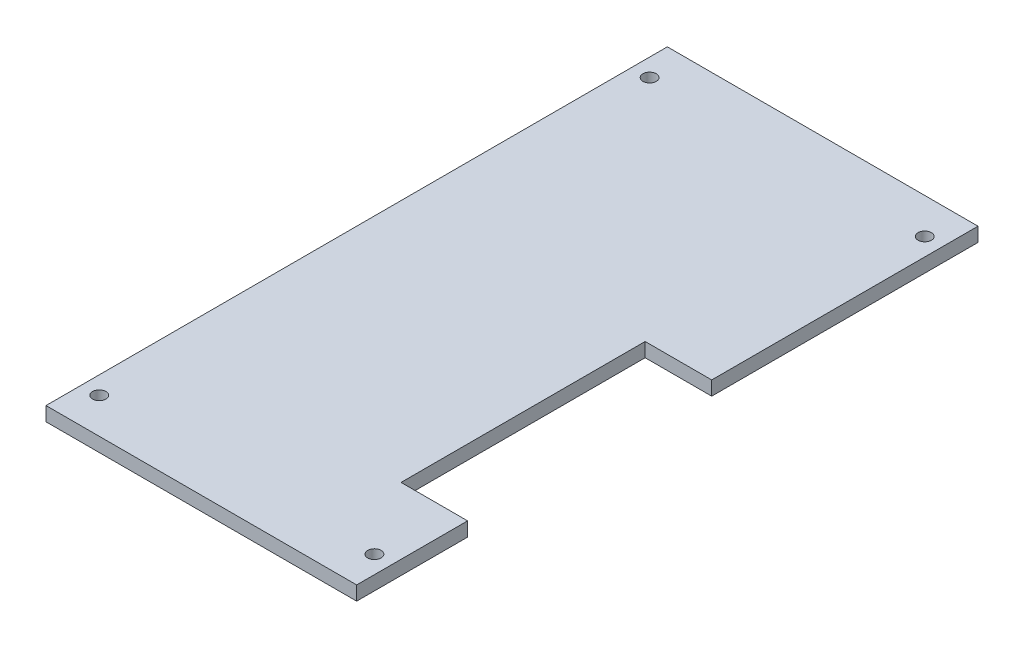
ISO-10303-21;
HEADER;
FILE_DESCRIPTION(('STEP AP214'),'2;1');
FILE_NAME('part.step','',(''),(''),'','','');
FILE_SCHEMA(('AUTOMOTIVE_DESIGN { 1 0 10303 214 1 1 1 1 }'));
ENDSEC;
DATA;
#1=APPLICATION_CONTEXT('core data for automotive mechanical design processes');
#2=APPLICATION_PROTOCOL_DEFINITION('international standard','automotive_design',2000,#1);
#3=PRODUCT_CONTEXT('',#1,'mechanical');
#4=PRODUCT('Part','Part','',(#3));
#5=PRODUCT_RELATED_PRODUCT_CATEGORY('part','',(#4));
#6=PRODUCT_DEFINITION_FORMATION('','',#4);
#7=PRODUCT_DEFINITION_CONTEXT('part definition',#1,'design');
#8=PRODUCT_DEFINITION('design','',#6,#7);
#9=PRODUCT_DEFINITION_SHAPE('','',#8);
#10=(LENGTH_UNIT() NAMED_UNIT(*) SI_UNIT(.MILLI.,.METRE.));
#11=(NAMED_UNIT(*) PLANE_ANGLE_UNIT() SI_UNIT($,.RADIAN.));
#12=(NAMED_UNIT(*) SI_UNIT($,.STERADIAN.) SOLID_ANGLE_UNIT());
#13=UNCERTAINTY_MEASURE_WITH_UNIT(LENGTH_MEASURE(1.E-05),#10,'distance_accuracy_value','');
#14=(GEOMETRIC_REPRESENTATION_CONTEXT(3) GLOBAL_UNCERTAINTY_ASSIGNED_CONTEXT((#13)) GLOBAL_UNIT_ASSIGNED_CONTEXT((#10,
#11,#12)) REPRESENTATION_CONTEXT('',''));
#15=CARTESIAN_POINT('',(0.,0.,0.));
#16=DIRECTION('',(0.,0.,1.));
#17=DIRECTION('',(1.,0.,0.));
#18=AXIS2_PLACEMENT_3D('',#15,#16,#17);
#19=CARTESIAN_POINT('',(0.,3.175,0.));
#20=DIRECTION('',(0.,1.,0.));
#21=DIRECTION('',(0.,0.,1.));
#22=AXIS2_PLACEMENT_3D('',#19,#20,#21);
#23=PLANE('',#22);
#24=CARTESIAN_POINT('',(-31.,3.175,-62.));
#25=DIRECTION('',(0.,1.,0.));
#26=DIRECTION('',(0.,0.,1.));
#27=AXIS2_PLACEMENT_3D('',#24,#25,#26);
#28=CIRCLE('',#27,1.5);
#29=CARTESIAN_POINT('',(-31.,3.175,-60.5));
#30=VERTEX_POINT('',#29);
#31=EDGE_CURVE('E192',#30,#30,#28,.T.);
#32=ORIENTED_EDGE('',*,*,#31,.F.);
#33=EDGE_LOOP('',(#32));
#34=FACE_BOUND('',#33,.T.);
#35=CARTESIAN_POINT('',(31.,3.175,62.));
#36=DIRECTION('',(0.,1.,0.));
#37=DIRECTION('',(0.,0.,1.));
#38=AXIS2_PLACEMENT_3D('',#35,#36,#37);
#39=CIRCLE('',#38,1.50000000000001);
#40=CARTESIAN_POINT('',(31.,3.175,63.5));
#41=VERTEX_POINT('',#40);
#42=EDGE_CURVE('E138',#41,#41,#39,.T.);
#43=ORIENTED_EDGE('',*,*,#42,.F.);
#44=EDGE_LOOP('',(#43));
#45=FACE_BOUND('',#44,.T.);
#46=DIRECTION('',(0.,0.,1.));
#47=VECTOR('',#46,1.);
#48=CARTESIAN_POINT('',(-35.,3.175,70.));
#49=LINE('',#48,#47);
#50=CARTESIAN_POINT('',(-35.,3.175,-70.));
#51=VERTEX_POINT('',#50);
#52=CARTESIAN_POINT('',(-35.,3.175,70.));
#53=VERTEX_POINT('',#52);
#54=EDGE_CURVE('E149',#51,#53,#49,.T.);
#55=ORIENTED_EDGE('',*,*,#54,.T.);
#56=DIRECTION('',(1.,0.,0.));
#57=VECTOR('',#56,1.);
#58=CARTESIAN_POINT('',(35.,3.175,70.));
#59=LINE('',#58,#57);
#60=CARTESIAN_POINT('',(35.,3.175,70.));
#61=VERTEX_POINT('',#60);
#62=EDGE_CURVE('E97',#53,#61,#59,.T.);
#63=ORIENTED_EDGE('',*,*,#62,.T.);
#64=DIRECTION('',(0.,0.,-1.));
#65=VECTOR('',#64,1.);
#66=CARTESIAN_POINT('',(35.,3.175,70.));
#67=LINE('',#66,#65);
#68=CARTESIAN_POINT('',(35.,3.175,45.));
#69=VERTEX_POINT('',#68);
#70=EDGE_CURVE('E164',#61,#69,#67,.T.);
#71=ORIENTED_EDGE('',*,*,#70,.T.);
#72=DIRECTION('',(-1.,0.,0.));
#73=VECTOR('',#72,1.);
#74=CARTESIAN_POINT('',(20.,3.175,45.));
#75=LINE('',#74,#73);
#76=CARTESIAN_POINT('',(20.,3.175,45.));
#77=VERTEX_POINT('',#76);
#78=EDGE_CURVE('E177',#69,#77,#75,.T.);
#79=ORIENTED_EDGE('',*,*,#78,.T.);
#80=DIRECTION('',(0.,0.,-1.));
#81=VECTOR('',#80,1.);
#82=CARTESIAN_POINT('',(20.,3.175,-9.99999998199999));
#83=LINE('',#82,#81);
#84=CARTESIAN_POINT('',(20.,3.175,-9.99999998199999));
#85=VERTEX_POINT('',#84);
#86=EDGE_CURVE('E116',#77,#85,#83,.T.);
#87=ORIENTED_EDGE('',*,*,#86,.T.);
#88=DIRECTION('',(1.,0.,0.));
#89=VECTOR('',#88,1.);
#90=CARTESIAN_POINT('',(35.,3.175,-9.99999998199999));
#91=LINE('',#90,#89);
#92=CARTESIAN_POINT('',(35.,3.175,-9.99999998199999));
#93=VERTEX_POINT('',#92);
#94=EDGE_CURVE('E110',#85,#93,#91,.T.);
#95=ORIENTED_EDGE('',*,*,#94,.T.);
#96=DIRECTION('',(0.,0.,-1.));
#97=VECTOR('',#96,1.);
#98=CARTESIAN_POINT('',(35.,3.175,-9.99999998199999));
#99=LINE('',#98,#97);
#100=CARTESIAN_POINT('',(35.,3.175,-70.));
#101=VERTEX_POINT('',#100);
#102=EDGE_CURVE('E114',#93,#101,#99,.T.);
#103=ORIENTED_EDGE('',*,*,#102,.T.);
#104=DIRECTION('',(-1.,0.,0.));
#105=VECTOR('',#104,1.);
#106=CARTESIAN_POINT('',(35.,3.175,-70.));
#107=LINE('',#106,#105);
#108=EDGE_CURVE('E54',#101,#51,#107,.T.);
#109=ORIENTED_EDGE('',*,*,#108,.T.);
#110=EDGE_LOOP('',(#55,#63,#71,#79,#87,#95,#103,#109));
#111=FACE_BOUND('',#110,.T.);
#112=CARTESIAN_POINT('',(-31.,3.175,62.));
#113=DIRECTION('',(0.,1.,0.));
#114=DIRECTION('',(0.,0.,-1.));
#115=AXIS2_PLACEMENT_3D('',#112,#113,#114);
#116=CIRCLE('',#115,1.50000000000001);
#117=CARTESIAN_POINT('',(-31.,3.175,60.5));
#118=VERTEX_POINT('',#117);
#119=EDGE_CURVE('E186',#118,#118,#116,.T.);
#120=ORIENTED_EDGE('',*,*,#119,.F.);
#121=EDGE_LOOP('',(#120));
#122=FACE_BOUND('',#121,.T.);
#123=CARTESIAN_POINT('',(31.,3.175,-62.));
#124=DIRECTION('',(0.,1.,0.));
#125=DIRECTION('',(0.,0.,-1.));
#126=AXIS2_PLACEMENT_3D('',#123,#124,#125);
#127=CIRCLE('',#126,1.50000000000001);
#128=CARTESIAN_POINT('',(31.,3.175,-63.5));
#129=VERTEX_POINT('',#128);
#130=EDGE_CURVE('E198',#129,#129,#127,.T.);
#131=ORIENTED_EDGE('',*,*,#130,.F.);
#132=EDGE_LOOP('',(#131));
#133=FACE_BOUND('',#132,.T.);
#134=ADVANCED_FACE('F37',(#34,#45,#111,#122,#133),#23,.T.);
#135=CARTESIAN_POINT('',(0.,0.,0.));
#136=DIRECTION('',(0.,1.,0.));
#137=DIRECTION('',(0.,0.,1.));
#138=AXIS2_PLACEMENT_3D('',#135,#136,#137);
#139=PLANE('',#138);
#140=CARTESIAN_POINT('',(-31.,0.,-62.));
#141=DIRECTION('',(0.,1.,0.));
#142=DIRECTION('',(0.,0.,1.));
#143=AXIS2_PLACEMENT_3D('',#140,#141,#142);
#144=CIRCLE('',#143,1.5);
#145=CARTESIAN_POINT('',(-31.,0.,-60.5));
#146=VERTEX_POINT('',#145);
#147=EDGE_CURVE('E195',#146,#146,#144,.T.);
#148=ORIENTED_EDGE('',*,*,#147,.T.);
#149=EDGE_LOOP('',(#148));
#150=FACE_BOUND('',#149,.T.);
#151=CARTESIAN_POINT('',(31.,0.,62.));
#152=DIRECTION('',(0.,1.,0.));
#153=DIRECTION('',(0.,0.,1.));
#154=AXIS2_PLACEMENT_3D('',#151,#152,#153);
#155=CIRCLE('',#154,1.50000000000001);
#156=CARTESIAN_POINT('',(31.,0.,63.5));
#157=VERTEX_POINT('',#156);
#158=EDGE_CURVE('E183',#157,#157,#155,.T.);
#159=ORIENTED_EDGE('',*,*,#158,.T.);
#160=EDGE_LOOP('',(#159));
#161=FACE_BOUND('',#160,.T.);
#162=DIRECTION('',(0.,0.,1.));
#163=VECTOR('',#162,1.);
#164=CARTESIAN_POINT('',(-35.,0.,70.));
#165=LINE('',#164,#163);
#166=CARTESIAN_POINT('',(-35.,0.,-70.));
#167=VERTEX_POINT('',#166);
#168=CARTESIAN_POINT('',(-35.,0.,70.));
#169=VERTEX_POINT('',#168);
#170=EDGE_CURVE('E134',#167,#169,#165,.T.);
#171=ORIENTED_EDGE('',*,*,#170,.F.);
#172=DIRECTION('',(-1.,0.,0.));
#173=VECTOR('',#172,1.);
#174=CARTESIAN_POINT('',(35.,0.,-70.));
#175=LINE('',#174,#173);
#176=CARTESIAN_POINT('',(35.,0.,-70.));
#177=VERTEX_POINT('',#176);
#178=EDGE_CURVE('E89',#177,#167,#175,.T.);
#179=ORIENTED_EDGE('',*,*,#178,.F.);
#180=DIRECTION('',(0.,0.,-1.));
#181=VECTOR('',#180,1.);
#182=CARTESIAN_POINT('',(35.,0.,-9.99999998199999));
#183=LINE('',#182,#181);
#184=CARTESIAN_POINT('',(35.,0.,-9.99999998199999));
#185=VERTEX_POINT('',#184);
#186=EDGE_CURVE('E83',#185,#177,#183,.T.);
#187=ORIENTED_EDGE('',*,*,#186,.F.);
#188=DIRECTION('',(1.,0.,0.));
#189=VECTOR('',#188,1.);
#190=CARTESIAN_POINT('',(35.,0.,-9.99999998199999));
#191=LINE('',#190,#189);
#192=CARTESIAN_POINT('',(20.,0.,-9.99999998199999));
#193=VERTEX_POINT('',#192);
#194=EDGE_CURVE('E124',#193,#185,#191,.T.);
#195=ORIENTED_EDGE('',*,*,#194,.F.);
#196=DIRECTION('',(0.,0.,-1.));
#197=VECTOR('',#196,1.);
#198=CARTESIAN_POINT('',(20.,0.,-9.99999998199999));
#199=LINE('',#198,#197);
#200=CARTESIAN_POINT('',(20.,0.,45.));
#201=VERTEX_POINT('',#200);
#202=EDGE_CURVE('E144',#201,#193,#199,.T.);
#203=ORIENTED_EDGE('',*,*,#202,.F.);
#204=DIRECTION('',(-1.,0.,0.));
#205=VECTOR('',#204,1.);
#206=CARTESIAN_POINT('',(20.,0.,45.));
#207=LINE('',#206,#205);
#208=CARTESIAN_POINT('',(35.,0.,45.));
#209=VERTEX_POINT('',#208);
#210=EDGE_CURVE('E142',#209,#201,#207,.T.);
#211=ORIENTED_EDGE('',*,*,#210,.F.);
#212=DIRECTION('',(0.,0.,-1.));
#213=VECTOR('',#212,1.);
#214=CARTESIAN_POINT('',(35.,0.,70.));
#215=LINE('',#214,#213);
#216=CARTESIAN_POINT('',(35.,0.,70.));
#217=VERTEX_POINT('',#216);
#218=EDGE_CURVE('E140',#217,#209,#215,.T.);
#219=ORIENTED_EDGE('',*,*,#218,.F.);
#220=DIRECTION('',(1.,0.,0.));
#221=VECTOR('',#220,1.);
#222=CARTESIAN_POINT('',(35.,0.,70.));
#223=LINE('',#222,#221);
#224=EDGE_CURVE('E137',#169,#217,#223,.T.);
#225=ORIENTED_EDGE('',*,*,#224,.F.);
#226=EDGE_LOOP('',(#171,#179,#187,#195,#203,#211,#219,#225));
#227=FACE_BOUND('',#226,.T.);
#228=CARTESIAN_POINT('',(-31.,0.,62.));
#229=DIRECTION('',(0.,1.,0.));
#230=DIRECTION('',(0.,0.,-1.));
#231=AXIS2_PLACEMENT_3D('',#228,#229,#230);
#232=CIRCLE('',#231,1.50000000000001);
#233=CARTESIAN_POINT('',(-31.,0.,60.5));
#234=VERTEX_POINT('',#233);
#235=EDGE_CURVE('E189',#234,#234,#232,.T.);
#236=ORIENTED_EDGE('',*,*,#235,.T.);
#237=EDGE_LOOP('',(#236));
#238=FACE_BOUND('',#237,.T.);
#239=CARTESIAN_POINT('',(31.,0.,-62.));
#240=DIRECTION('',(0.,1.,0.));
#241=DIRECTION('',(0.,0.,-1.));
#242=AXIS2_PLACEMENT_3D('',#239,#240,#241);
#243=CIRCLE('',#242,1.50000000000001);
#244=CARTESIAN_POINT('',(31.,0.,-63.5));
#245=VERTEX_POINT('',#244);
#246=EDGE_CURVE('E201',#245,#245,#243,.T.);
#247=ORIENTED_EDGE('',*,*,#246,.T.);
#248=EDGE_LOOP('',(#247));
#249=FACE_BOUND('',#248,.T.);
#250=ADVANCED_FACE('F168',(#150,#161,#227,#238,#249),#139,.F.);
#251=CARTESIAN_POINT('',(-35.,3.175,70.));
#252=DIRECTION('',(1.,0.,0.));
#253=DIRECTION('',(0.,0.,-1.));
#254=AXIS2_PLACEMENT_3D('',#251,#252,#253);
#255=PLANE('',#254);
#256=ORIENTED_EDGE('',*,*,#170,.T.);
#257=DIRECTION('',(0.,-1.,0.));
#258=VECTOR('',#257,1.);
#259=CARTESIAN_POINT('',(-35.,3.175,70.));
#260=LINE('',#259,#258);
#261=EDGE_CURVE('E11',#53,#169,#260,.T.);
#262=ORIENTED_EDGE('',*,*,#261,.F.);
#263=ORIENTED_EDGE('',*,*,#54,.F.);
#264=DIRECTION('',(0.,-1.,0.));
#265=VECTOR('',#264,1.);
#266=CARTESIAN_POINT('',(-35.,3.175,-70.));
#267=LINE('',#266,#265);
#268=EDGE_CURVE('E130',#51,#167,#267,.T.);
#269=ORIENTED_EDGE('',*,*,#268,.T.);
#270=EDGE_LOOP('',(#256,#262,#263,#269));
#271=FACE_BOUND('',#270,.T.);
#272=ADVANCED_FACE('F39',(#271),#255,.F.);
#273=CARTESIAN_POINT('',(35.,3.175,70.));
#274=DIRECTION('',(0.,0.,-1.));
#275=DIRECTION('',(-1.,0.,0.));
#276=AXIS2_PLACEMENT_3D('',#273,#274,#275);
#277=PLANE('',#276);
#278=ORIENTED_EDGE('',*,*,#224,.T.);
#279=DIRECTION('',(0.,-1.,0.));
#280=VECTOR('',#279,1.);
#281=CARTESIAN_POINT('',(35.,3.175,70.));
#282=LINE('',#281,#280);
#283=EDGE_CURVE('E46',#61,#217,#282,.T.);
#284=ORIENTED_EDGE('',*,*,#283,.F.);
#285=ORIENTED_EDGE('',*,*,#62,.F.);
#286=ORIENTED_EDGE('',*,*,#261,.T.);
#287=EDGE_LOOP('',(#278,#284,#285,#286));
#288=FACE_BOUND('',#287,.T.);
#289=ADVANCED_FACE('F236',(#288),#277,.F.);
#290=CARTESIAN_POINT('',(35.,3.175,70.));
#291=DIRECTION('',(-1.,0.,0.));
#292=DIRECTION('',(0.,0.,1.));
#293=AXIS2_PLACEMENT_3D('',#290,#291,#292);
#294=PLANE('',#293);
#295=ORIENTED_EDGE('',*,*,#218,.T.);
#296=DIRECTION('',(0.,-1.,0.));
#297=VECTOR('',#296,1.);
#298=CARTESIAN_POINT('',(35.,3.175,45.));
#299=LINE('',#298,#297);
#300=EDGE_CURVE('E156',#69,#209,#299,.T.);
#301=ORIENTED_EDGE('',*,*,#300,.F.);
#302=ORIENTED_EDGE('',*,*,#70,.F.);
#303=ORIENTED_EDGE('',*,*,#283,.T.);
#304=EDGE_LOOP('',(#295,#301,#302,#303));
#305=FACE_BOUND('',#304,.T.);
#306=ADVANCED_FACE('F162',(#305),#294,.F.);
#307=CARTESIAN_POINT('',(20.,3.175,45.));
#308=DIRECTION('',(0.,0.,1.));
#309=DIRECTION('',(1.,0.,0.));
#310=AXIS2_PLACEMENT_3D('',#307,#308,#309);
#311=PLANE('',#310);
#312=ORIENTED_EDGE('',*,*,#210,.T.);
#313=DIRECTION('',(0.,-1.,0.));
#314=VECTOR('',#313,1.);
#315=CARTESIAN_POINT('',(20.,3.175,45.));
#316=LINE('',#315,#314);
#317=EDGE_CURVE('E153',#77,#201,#316,.T.);
#318=ORIENTED_EDGE('',*,*,#317,.F.);
#319=ORIENTED_EDGE('',*,*,#78,.F.);
#320=ORIENTED_EDGE('',*,*,#300,.T.);
#321=EDGE_LOOP('',(#312,#318,#319,#320));
#322=FACE_BOUND('',#321,.T.);
#323=ADVANCED_FACE('F173',(#322),#311,.F.);
#324=CARTESIAN_POINT('',(20.,3.175,-9.99999998199999));
#325=DIRECTION('',(-1.,0.,0.));
#326=DIRECTION('',(0.,0.,1.));
#327=AXIS2_PLACEMENT_3D('',#324,#325,#326);
#328=PLANE('',#327);
#329=ORIENTED_EDGE('',*,*,#202,.T.);
#330=DIRECTION('',(0.,-1.,0.));
#331=VECTOR('',#330,1.);
#332=CARTESIAN_POINT('',(20.,3.175,-9.99999998199999));
#333=LINE('',#332,#331);
#334=EDGE_CURVE('E125',#85,#193,#333,.T.);
#335=ORIENTED_EDGE('',*,*,#334,.F.);
#336=ORIENTED_EDGE('',*,*,#86,.F.);
#337=ORIENTED_EDGE('',*,*,#317,.T.);
#338=EDGE_LOOP('',(#329,#335,#336,#337));
#339=FACE_BOUND('',#338,.T.);
#340=ADVANCED_FACE('F176',(#339),#328,.F.);
#341=CARTESIAN_POINT('',(35.,3.175,-9.99999998199999));
#342=DIRECTION('',(0.,0.,-1.));
#343=DIRECTION('',(-1.,0.,0.));
#344=AXIS2_PLACEMENT_3D('',#341,#342,#343);
#345=PLANE('',#344);
#346=ORIENTED_EDGE('',*,*,#194,.T.);
#347=DIRECTION('',(0.,-1.,0.));
#348=VECTOR('',#347,1.);
#349=CARTESIAN_POINT('',(35.,3.175,-9.99999998199999));
#350=LINE('',#349,#348);
#351=EDGE_CURVE('E121',#93,#185,#350,.T.);
#352=ORIENTED_EDGE('',*,*,#351,.F.);
#353=ORIENTED_EDGE('',*,*,#94,.F.);
#354=ORIENTED_EDGE('',*,*,#334,.T.);
#355=EDGE_LOOP('',(#346,#352,#353,#354));
#356=FACE_BOUND('',#355,.T.);
#357=ADVANCED_FACE('F122',(#356),#345,.F.);
#358=CARTESIAN_POINT('',(35.,3.175,-9.99999998199999));
#359=DIRECTION('',(-1.,0.,0.));
#360=DIRECTION('',(0.,0.,1.));
#361=AXIS2_PLACEMENT_3D('',#358,#359,#360);
#362=PLANE('',#361);
#363=ORIENTED_EDGE('',*,*,#186,.T.);
#364=DIRECTION('',(0.,-1.,0.));
#365=VECTOR('',#364,1.);
#366=CARTESIAN_POINT('',(35.,3.175,-70.));
#367=LINE('',#366,#365);
#368=EDGE_CURVE('E126',#101,#177,#367,.T.);
#369=ORIENTED_EDGE('',*,*,#368,.F.);
#370=ORIENTED_EDGE('',*,*,#102,.F.);
#371=ORIENTED_EDGE('',*,*,#351,.T.);
#372=EDGE_LOOP('',(#363,#369,#370,#371));
#373=FACE_BOUND('',#372,.T.);
#374=ADVANCED_FACE('F128',(#373),#362,.F.);
#375=CARTESIAN_POINT('',(35.,3.175,-70.));
#376=DIRECTION('',(0.,0.,1.));
#377=DIRECTION('',(1.,0.,0.));
#378=AXIS2_PLACEMENT_3D('',#375,#376,#377);
#379=PLANE('',#378);
#380=ORIENTED_EDGE('',*,*,#178,.T.);
#381=ORIENTED_EDGE('',*,*,#268,.F.);
#382=ORIENTED_EDGE('',*,*,#108,.F.);
#383=ORIENTED_EDGE('',*,*,#368,.T.);
#384=EDGE_LOOP('',(#380,#381,#382,#383));
#385=FACE_BOUND('',#384,.T.);
#386=ADVANCED_FACE('F224',(#385),#379,.F.);
#387=CARTESIAN_POINT('',(31.,3.175,62.));
#388=DIRECTION('',(0.,-1.,0.));
#389=DIRECTION('',(0.,0.,-1.));
#390=AXIS2_PLACEMENT_3D('',#387,#388,#389);
#391=CYLINDRICAL_SURFACE('',#390,1.50000000000001);
#392=ORIENTED_EDGE('',*,*,#42,.T.);
#393=EDGE_LOOP('',(#392));
#394=FACE_BOUND('',#393,.T.);
#395=ORIENTED_EDGE('',*,*,#158,.F.);
#396=EDGE_LOOP('',(#395));
#397=FACE_BOUND('',#396,.T.);
#398=ADVANCED_FACE('F221',(#394,#397),#391,.F.);
#399=CARTESIAN_POINT('',(-31.,3.175,62.));
#400=DIRECTION('',(0.,-1.,0.));
#401=DIRECTION('',(0.,0.,-1.));
#402=AXIS2_PLACEMENT_3D('',#399,#400,#401);
#403=CYLINDRICAL_SURFACE('',#402,1.50000000000001);
#404=ORIENTED_EDGE('',*,*,#119,.T.);
#405=EDGE_LOOP('',(#404));
#406=FACE_BOUND('',#405,.T.);
#407=ORIENTED_EDGE('',*,*,#235,.F.);
#408=EDGE_LOOP('',(#407));
#409=FACE_BOUND('',#408,.T.);
#410=ADVANCED_FACE('F300',(#406,#409),#403,.F.);
#411=CARTESIAN_POINT('',(-31.,3.175,-62.));
#412=DIRECTION('',(0.,-1.,0.));
#413=DIRECTION('',(0.,0.,-1.));
#414=AXIS2_PLACEMENT_3D('',#411,#412,#413);
#415=CYLINDRICAL_SURFACE('',#414,1.5);
#416=ORIENTED_EDGE('',*,*,#31,.T.);
#417=EDGE_LOOP('',(#416));
#418=FACE_BOUND('',#417,.T.);
#419=ORIENTED_EDGE('',*,*,#147,.F.);
#420=EDGE_LOOP('',(#419));
#421=FACE_BOUND('',#420,.T.);
#422=ADVANCED_FACE('F308',(#418,#421),#415,.F.);
#423=CARTESIAN_POINT('',(31.,3.175,-62.));
#424=DIRECTION('',(0.,-1.,0.));
#425=DIRECTION('',(0.,0.,-1.));
#426=AXIS2_PLACEMENT_3D('',#423,#424,#425);
#427=CYLINDRICAL_SURFACE('',#426,1.50000000000001);
#428=ORIENTED_EDGE('',*,*,#130,.T.);
#429=EDGE_LOOP('',(#428));
#430=FACE_BOUND('',#429,.T.);
#431=ORIENTED_EDGE('',*,*,#246,.F.);
#432=EDGE_LOOP('',(#431));
#433=FACE_BOUND('',#432,.T.);
#434=ADVANCED_FACE('F207',(#430,#433),#427,.F.);
#435=CLOSED_SHELL('',(#134,#250,#272,#289,#306,#323,#340,#357,#374,#386,#398,#410,#422,#434));
#436=MANIFOLD_SOLID_BREP('B2',#435);
#437=ADVANCED_BREP_SHAPE_REPRESENTATION('',(#18,#436),#14);
#438=SHAPE_DEFINITION_REPRESENTATION(#9,#437);
ENDSEC;
END-ISO-10303-21;
